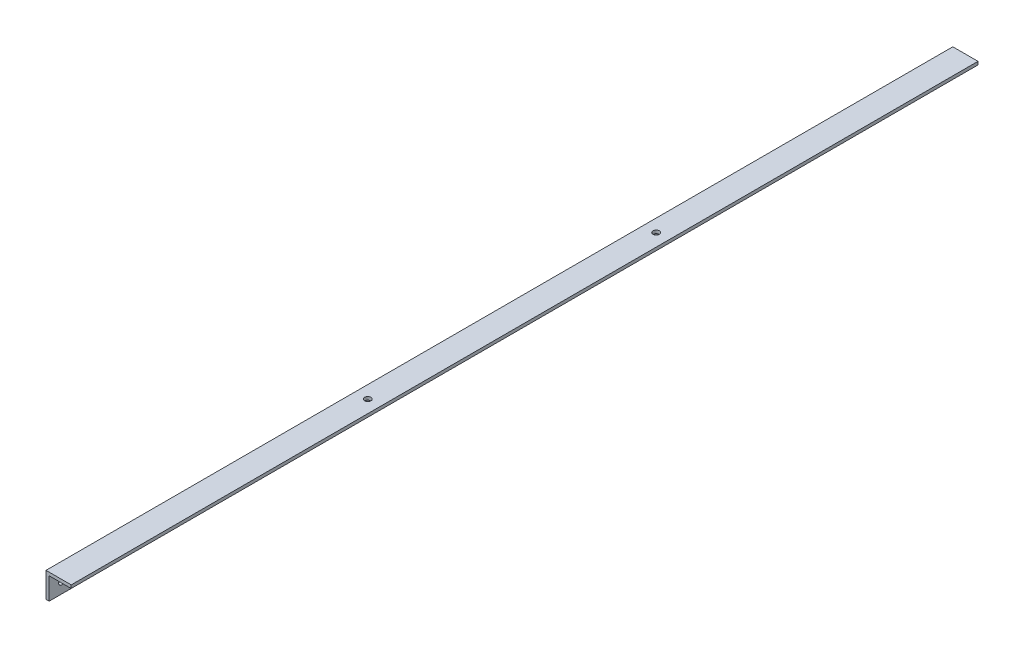
ISO-10303-21;
HEADER;
FILE_DESCRIPTION(('STEP AP214'),'2;1');
FILE_NAME('part.step','',(''),(''),'','','');
FILE_SCHEMA(('AUTOMOTIVE_DESIGN { 1 0 10303 214 1 1 1 1 }'));
ENDSEC;
DATA;
#1=APPLICATION_CONTEXT('core data for automotive mechanical design processes');
#2=APPLICATION_PROTOCOL_DEFINITION('international standard','automotive_design',2000,#1);
#3=PRODUCT_CONTEXT('',#1,'mechanical');
#4=PRODUCT('Part','Part','',(#3));
#5=PRODUCT_RELATED_PRODUCT_CATEGORY('part','',(#4));
#6=PRODUCT_DEFINITION_FORMATION('','',#4);
#7=PRODUCT_DEFINITION_CONTEXT('part definition',#1,'design');
#8=PRODUCT_DEFINITION('design','',#6,#7);
#9=PRODUCT_DEFINITION_SHAPE('','',#8);
#10=(LENGTH_UNIT() NAMED_UNIT(*) SI_UNIT(.MILLI.,.METRE.));
#11=(NAMED_UNIT(*) PLANE_ANGLE_UNIT() SI_UNIT($,.RADIAN.));
#12=(NAMED_UNIT(*) SI_UNIT($,.STERADIAN.) SOLID_ANGLE_UNIT());
#13=UNCERTAINTY_MEASURE_WITH_UNIT(LENGTH_MEASURE(1.E-05),#10,'distance_accuracy_value','');
#14=(GEOMETRIC_REPRESENTATION_CONTEXT(3) GLOBAL_UNCERTAINTY_ASSIGNED_CONTEXT((#13)) GLOBAL_UNIT_ASSIGNED_CONTEXT((#10,
#11,#12)) REPRESENTATION_CONTEXT('',''));
#15=CARTESIAN_POINT('',(0.,0.,0.));
#16=DIRECTION('',(0.,0.,1.));
#17=DIRECTION('',(1.,0.,0.));
#18=AXIS2_PLACEMENT_3D('',#15,#16,#17);
#19=CARTESIAN_POINT('',(3.175,0.,914.4));
#20=DIRECTION('',(0.,1.,0.));
#21=DIRECTION('',(0.,0.,1.));
#22=AXIS2_PLACEMENT_3D('',#19,#20,#21);
#23=PLANE('',#22);
#24=DIRECTION('',(1.,0.,0.));
#25=VECTOR('',#24,1.);
#26=CARTESIAN_POINT('',(3.175,0.,0.));
#27=LINE('',#26,#25);
#28=CARTESIAN_POINT('',(0.,0.,0.));
#29=VERTEX_POINT('',#28);
#30=CARTESIAN_POINT('',(3.175,0.,0.));
#31=VERTEX_POINT('',#30);
#32=EDGE_CURVE('E117',#29,#31,#27,.T.);
#33=ORIENTED_EDGE('',*,*,#32,.T.);
#34=DIRECTION('',(0.,0.,-1.));
#35=VECTOR('',#34,1.);
#36=CARTESIAN_POINT('',(3.175,0.,914.4));
#37=LINE('',#36,#35);
#38=CARTESIAN_POINT('',(3.175,0.,914.4));
#39=VERTEX_POINT('',#38);
#40=EDGE_CURVE('E11',#39,#31,#37,.T.);
#41=ORIENTED_EDGE('',*,*,#40,.F.);
#42=DIRECTION('',(1.,0.,0.));
#43=VECTOR('',#42,1.);
#44=CARTESIAN_POINT('',(3.175,0.,914.4));
#45=LINE('',#44,#43);
#46=CARTESIAN_POINT('',(0.,0.,914.4));
#47=VERTEX_POINT('',#46);
#48=EDGE_CURVE('E128',#47,#39,#45,.T.);
#49=ORIENTED_EDGE('',*,*,#48,.F.);
#50=DIRECTION('',(0.,0.,-1.));
#51=VECTOR('',#50,1.);
#52=CARTESIAN_POINT('',(0.,0.,914.4));
#53=LINE('',#52,#51);
#54=EDGE_CURVE('E113',#47,#29,#53,.T.);
#55=ORIENTED_EDGE('',*,*,#54,.T.);
#56=EDGE_LOOP('',(#33,#41,#49,#55));
#57=FACE_BOUND('',#56,.T.);
#58=ADVANCED_FACE('F33',(#57),#23,.F.);
#59=CARTESIAN_POINT('',(3.175,0.,914.4));
#60=DIRECTION('',(-1.,0.,0.));
#61=DIRECTION('',(0.,0.,1.));
#62=AXIS2_PLACEMENT_3D('',#59,#60,#61);
#63=PLANE('',#62);
#64=CARTESIAN_POINT('',(3.175,11.1124999999999,12.7));
#65=DIRECTION('',(1.,0.,0.));
#66=DIRECTION('',(0.,0.,-1.));
#67=AXIS2_PLACEMENT_3D('',#64,#65,#66);
#68=CIRCLE('',#67,3.175);
#69=CARTESIAN_POINT('',(3.175,11.1124999999999,9.52500000000004));
#70=VERTEX_POINT('',#69);
#71=EDGE_CURVE('E262',#70,#70,#68,.T.);
#72=ORIENTED_EDGE('',*,*,#71,.F.);
#73=EDGE_LOOP('',(#72));
#74=FACE_BOUND('',#73,.T.);
#75=CARTESIAN_POINT('',(3.175,11.1125,901.7));
#76=DIRECTION('',(1.,0.,0.));
#77=DIRECTION('',(0.,0.,-1.));
#78=AXIS2_PLACEMENT_3D('',#75,#76,#77);
#79=CIRCLE('',#78,3.17499999999997);
#80=CARTESIAN_POINT('',(3.175,11.1125,898.525));
#81=VERTEX_POINT('',#80);
#82=EDGE_CURVE('E265',#81,#81,#79,.T.);
#83=ORIENTED_EDGE('',*,*,#82,.F.);
#84=EDGE_LOOP('',(#83));
#85=FACE_BOUND('',#84,.T.);
#86=CARTESIAN_POINT('',(3.17500000000004,12.7,576.2625));
#87=DIRECTION('',(-1.,0.,0.));
#88=DIRECTION('',(0.,0.,1.));
#89=AXIS2_PLACEMENT_3D('',#86,#87,#88);
#90=CIRCLE('',#89,3.17499999999997);
#91=CARTESIAN_POINT('',(3.17500000000004,12.7,579.4375));
#92=VERTEX_POINT('',#91);
#93=EDGE_CURVE('E289',#92,#92,#90,.T.);
#94=ORIENTED_EDGE('',*,*,#93,.T.);
#95=EDGE_LOOP('',(#94));
#96=FACE_BOUND('',#95,.T.);
#97=CARTESIAN_POINT('',(3.17500000000004,12.7,338.1375));
#98=DIRECTION('',(-1.,0.,0.));
#99=DIRECTION('',(0.,0.,1.));
#100=AXIS2_PLACEMENT_3D('',#97,#98,#99);
#101=CIRCLE('',#100,3.17499999999997);
#102=CARTESIAN_POINT('',(3.17500000000004,12.7,341.3125));
#103=VERTEX_POINT('',#102);
#104=EDGE_CURVE('E121',#103,#103,#101,.T.);
#105=ORIENTED_EDGE('',*,*,#104,.T.);
#106=EDGE_LOOP('',(#105));
#107=FACE_BOUND('',#106,.T.);
#108=DIRECTION('',(0.,1.,0.));
#109=VECTOR('',#108,1.);
#110=CARTESIAN_POINT('',(3.175,0.,0.));
#111=LINE('',#110,#109);
#112=CARTESIAN_POINT('',(3.175,22.225,0.));
#113=VERTEX_POINT('',#112);
#114=EDGE_CURVE('E120',#31,#113,#111,.T.);
#115=ORIENTED_EDGE('',*,*,#114,.T.);
#116=DIRECTION('',(0.,0.,-1.));
#117=VECTOR('',#116,1.);
#118=CARTESIAN_POINT('',(3.175,22.225,914.4));
#119=LINE('',#118,#117);
#120=CARTESIAN_POINT('',(3.175,22.225,914.4));
#121=VERTEX_POINT('',#120);
#122=EDGE_CURVE('E41',#121,#113,#119,.T.);
#123=ORIENTED_EDGE('',*,*,#122,.F.);
#124=DIRECTION('',(0.,1.,0.));
#125=VECTOR('',#124,1.);
#126=CARTESIAN_POINT('',(3.175,0.,914.4));
#127=LINE('',#126,#125);
#128=EDGE_CURVE('E86',#39,#121,#127,.T.);
#129=ORIENTED_EDGE('',*,*,#128,.F.);
#130=ORIENTED_EDGE('',*,*,#40,.T.);
#131=EDGE_LOOP('',(#115,#123,#129,#130));
#132=FACE_BOUND('',#131,.T.);
#133=ADVANCED_FACE('F158',(#74,#85,#96,#107,#132),#63,.F.);
#134=CARTESIAN_POINT('',(3.175,22.225,914.4));
#135=DIRECTION('',(0.,1.,0.));
#136=DIRECTION('',(0.,0.,1.));
#137=AXIS2_PLACEMENT_3D('',#134,#135,#136);
#138=PLANE('',#137);
#139=CARTESIAN_POINT('',(12.7,22.225,602.59171024299));
#140=DIRECTION('',(0.,1.,0.));
#141=DIRECTION('',(0.,0.,1.));
#142=AXIS2_PLACEMENT_3D('',#139,#140,#141);
#143=CIRCLE('',#142,3.175);
#144=CARTESIAN_POINT('',(12.7,22.225,605.76671024299));
#145=VERTEX_POINT('',#144);
#146=EDGE_CURVE('E277',#145,#145,#143,.T.);
#147=ORIENTED_EDGE('',*,*,#146,.T.);
#148=EDGE_LOOP('',(#147));
#149=FACE_BOUND('',#148,.T.);
#150=CARTESIAN_POINT('',(12.7,22.225,311.80828975701));
#151=DIRECTION('',(0.,1.,0.));
#152=DIRECTION('',(0.,0.,1.));
#153=AXIS2_PLACEMENT_3D('',#150,#151,#152);
#154=CIRCLE('',#153,3.175);
#155=CARTESIAN_POINT('',(12.7,22.225,314.98328975701));
#156=VERTEX_POINT('',#155);
#157=EDGE_CURVE('E283',#156,#156,#154,.T.);
#158=ORIENTED_EDGE('',*,*,#157,.T.);
#159=EDGE_LOOP('',(#158));
#160=FACE_BOUND('',#159,.T.);
#161=DIRECTION('',(1.,0.,0.));
#162=VECTOR('',#161,1.);
#163=CARTESIAN_POINT('',(3.175,22.225,0.));
#164=LINE('',#163,#162);
#165=CARTESIAN_POINT('',(25.4,22.225,0.));
#166=VERTEX_POINT('',#165);
#167=EDGE_CURVE('E123',#113,#166,#164,.T.);
#168=ORIENTED_EDGE('',*,*,#167,.T.);
#169=DIRECTION('',(0.,0.,-1.));
#170=VECTOR('',#169,1.);
#171=CARTESIAN_POINT('',(25.4,22.225,914.4));
#172=LINE('',#171,#170);
#173=CARTESIAN_POINT('',(25.4,22.225,914.4));
#174=VERTEX_POINT('',#173);
#175=EDGE_CURVE('E108',#174,#166,#172,.T.);
#176=ORIENTED_EDGE('',*,*,#175,.F.);
#177=DIRECTION('',(1.,0.,0.));
#178=VECTOR('',#177,1.);
#179=CARTESIAN_POINT('',(3.175,22.225,914.4));
#180=LINE('',#179,#178);
#181=EDGE_CURVE('E99',#121,#174,#180,.T.);
#182=ORIENTED_EDGE('',*,*,#181,.F.);
#183=ORIENTED_EDGE('',*,*,#122,.T.);
#184=EDGE_LOOP('',(#168,#176,#182,#183));
#185=FACE_BOUND('',#184,.T.);
#186=ADVANCED_FACE('F134',(#149,#160,#185),#138,.F.);
#187=CARTESIAN_POINT('',(25.4,22.225,914.4));
#188=DIRECTION('',(-1.,0.,0.));
#189=DIRECTION('',(0.,0.,1.));
#190=AXIS2_PLACEMENT_3D('',#187,#188,#189);
#191=PLANE('',#190);
#192=DIRECTION('',(0.,1.,0.));
#193=VECTOR('',#192,1.);
#194=CARTESIAN_POINT('',(25.4,22.225,0.));
#195=LINE('',#194,#193);
#196=CARTESIAN_POINT('',(25.4,25.4,0.));
#197=VERTEX_POINT('',#196);
#198=EDGE_CURVE('E107',#166,#197,#195,.T.);
#199=ORIENTED_EDGE('',*,*,#198,.T.);
#200=DIRECTION('',(0.,0.,-1.));
#201=VECTOR('',#200,1.);
#202=CARTESIAN_POINT('',(25.4,25.4,914.4));
#203=LINE('',#202,#201);
#204=CARTESIAN_POINT('',(25.4,25.4,914.4));
#205=VERTEX_POINT('',#204);
#206=EDGE_CURVE('E104',#205,#197,#203,.T.);
#207=ORIENTED_EDGE('',*,*,#206,.F.);
#208=DIRECTION('',(0.,1.,0.));
#209=VECTOR('',#208,1.);
#210=CARTESIAN_POINT('',(25.4,22.225,914.4));
#211=LINE('',#210,#209);
#212=EDGE_CURVE('E93',#174,#205,#211,.T.);
#213=ORIENTED_EDGE('',*,*,#212,.F.);
#214=ORIENTED_EDGE('',*,*,#175,.T.);
#215=EDGE_LOOP('',(#199,#207,#213,#214));
#216=FACE_BOUND('',#215,.T.);
#217=ADVANCED_FACE('F105',(#216),#191,.F.);
#218=CARTESIAN_POINT('',(0.,25.4,914.4));
#219=DIRECTION('',(0.,-1.,0.));
#220=DIRECTION('',(0.,0.,-1.));
#221=AXIS2_PLACEMENT_3D('',#218,#219,#220);
#222=PLANE('',#221);
#223=CARTESIAN_POINT('',(12.7,25.4,602.59171024299));
#224=DIRECTION('',(0.,1.,0.));
#225=DIRECTION('',(0.,0.,1.));
#226=AXIS2_PLACEMENT_3D('',#223,#224,#225);
#227=CIRCLE('',#226,3.175);
#228=CARTESIAN_POINT('',(12.7,25.4,605.76671024299));
#229=VERTEX_POINT('',#228);
#230=EDGE_CURVE('E274',#229,#229,#227,.T.);
#231=ORIENTED_EDGE('',*,*,#230,.F.);
#232=EDGE_LOOP('',(#231));
#233=FACE_BOUND('',#232,.T.);
#234=CARTESIAN_POINT('',(12.7,25.4,311.80828975701));
#235=DIRECTION('',(0.,1.,0.));
#236=DIRECTION('',(0.,0.,-1.));
#237=AXIS2_PLACEMENT_3D('',#234,#235,#236);
#238=CIRCLE('',#237,3.175);
#239=CARTESIAN_POINT('',(12.7,25.4,308.63328975701));
#240=VERTEX_POINT('',#239);
#241=EDGE_CURVE('E280',#240,#240,#238,.T.);
#242=ORIENTED_EDGE('',*,*,#241,.F.);
#243=EDGE_LOOP('',(#242));
#244=FACE_BOUND('',#243,.T.);
#245=DIRECTION('',(-1.,0.,0.));
#246=VECTOR('',#245,1.);
#247=CARTESIAN_POINT('',(0.,25.4,0.));
#248=LINE('',#247,#246);
#249=CARTESIAN_POINT('',(0.,25.4,0.));
#250=VERTEX_POINT('',#249);
#251=EDGE_CURVE('E72',#197,#250,#248,.T.);
#252=ORIENTED_EDGE('',*,*,#251,.T.);
#253=DIRECTION('',(0.,0.,-1.));
#254=VECTOR('',#253,1.);
#255=CARTESIAN_POINT('',(0.,25.4,914.4));
#256=LINE('',#255,#254);
#257=CARTESIAN_POINT('',(0.,25.4,914.4));
#258=VERTEX_POINT('',#257);
#259=EDGE_CURVE('E109',#258,#250,#256,.T.);
#260=ORIENTED_EDGE('',*,*,#259,.F.);
#261=DIRECTION('',(-1.,0.,0.));
#262=VECTOR('',#261,1.);
#263=CARTESIAN_POINT('',(0.,25.4,914.4));
#264=LINE('',#263,#262);
#265=EDGE_CURVE('E97',#205,#258,#264,.T.);
#266=ORIENTED_EDGE('',*,*,#265,.F.);
#267=ORIENTED_EDGE('',*,*,#206,.T.);
#268=EDGE_LOOP('',(#252,#260,#266,#267));
#269=FACE_BOUND('',#268,.T.);
#270=ADVANCED_FACE('F111',(#233,#244,#269),#222,.F.);
#271=CARTESIAN_POINT('',(0.,0.,914.4));
#272=DIRECTION('',(1.,0.,0.));
#273=DIRECTION('',(0.,0.,-1.));
#274=AXIS2_PLACEMENT_3D('',#271,#272,#273);
#275=PLANE('',#274);
#276=CARTESIAN_POINT('',(0.,11.1124999999999,12.7));
#277=DIRECTION('',(1.,0.,0.));
#278=DIRECTION('',(0.,0.,-1.));
#279=AXIS2_PLACEMENT_3D('',#276,#277,#278);
#280=CIRCLE('',#279,3.175);
#281=CARTESIAN_POINT('',(0.,11.1124999999999,9.52500000000004));
#282=VERTEX_POINT('',#281);
#283=EDGE_CURVE('E264',#282,#282,#280,.F.);
#284=ORIENTED_EDGE('',*,*,#283,.F.);
#285=EDGE_LOOP('',(#284));
#286=FACE_BOUND('',#285,.T.);
#287=CARTESIAN_POINT('',(0.,11.1125,901.7));
#288=DIRECTION('',(1.,0.,0.));
#289=DIRECTION('',(0.,0.,-1.));
#290=AXIS2_PLACEMENT_3D('',#287,#288,#289);
#291=CIRCLE('',#290,3.17499999999997);
#292=CARTESIAN_POINT('',(0.,11.1125,898.525));
#293=VERTEX_POINT('',#292);
#294=EDGE_CURVE('E268',#293,#293,#291,.F.);
#295=ORIENTED_EDGE('',*,*,#294,.F.);
#296=EDGE_LOOP('',(#295));
#297=FACE_BOUND('',#296,.T.);
#298=CARTESIAN_POINT('',(0.,12.7,576.2625));
#299=DIRECTION('',(-1.,0.,0.));
#300=DIRECTION('',(0.,0.,-1.));
#301=AXIS2_PLACEMENT_3D('',#298,#299,#300);
#302=CIRCLE('',#301,3.17499999999997);
#303=CARTESIAN_POINT('',(0.,12.7,573.0875));
#304=VERTEX_POINT('',#303);
#305=EDGE_CURVE('E286',#304,#304,#302,.T.);
#306=ORIENTED_EDGE('',*,*,#305,.F.);
#307=EDGE_LOOP('',(#306));
#308=FACE_BOUND('',#307,.T.);
#309=CARTESIAN_POINT('',(0.,12.7,338.1375));
#310=DIRECTION('',(-1.,0.,0.));
#311=DIRECTION('',(0.,0.,1.));
#312=AXIS2_PLACEMENT_3D('',#309,#310,#311);
#313=CIRCLE('',#312,3.17499999999997);
#314=CARTESIAN_POINT('',(0.,12.7,341.3125));
#315=VERTEX_POINT('',#314);
#316=EDGE_CURVE('E292',#315,#315,#313,.T.);
#317=ORIENTED_EDGE('',*,*,#316,.F.);
#318=EDGE_LOOP('',(#317));
#319=FACE_BOUND('',#318,.T.);
#320=DIRECTION('',(0.,-1.,0.));
#321=VECTOR('',#320,1.);
#322=CARTESIAN_POINT('',(0.,0.,0.));
#323=LINE('',#322,#321);
#324=EDGE_CURVE('E78',#250,#29,#323,.T.);
#325=ORIENTED_EDGE('',*,*,#324,.T.);
#326=ORIENTED_EDGE('',*,*,#54,.F.);
#327=DIRECTION('',(0.,-1.,0.));
#328=VECTOR('',#327,1.);
#329=CARTESIAN_POINT('',(0.,0.,914.4));
#330=LINE('',#329,#328);
#331=EDGE_CURVE('E49',#258,#47,#330,.T.);
#332=ORIENTED_EDGE('',*,*,#331,.F.);
#333=ORIENTED_EDGE('',*,*,#259,.T.);
#334=EDGE_LOOP('',(#325,#326,#332,#333));
#335=FACE_BOUND('',#334,.T.);
#336=ADVANCED_FACE('F141',(#286,#297,#308,#319,#335),#275,.F.);
#337=CARTESIAN_POINT('',(0.,0.,914.4));
#338=DIRECTION('',(0.,0.,-1.));
#339=DIRECTION('',(-1.,0.,0.));
#340=AXIS2_PLACEMENT_3D('',#337,#338,#339);
#341=PLANE('',#340);
#342=ORIENTED_EDGE('',*,*,#48,.T.);
#343=ORIENTED_EDGE('',*,*,#128,.T.);
#344=ORIENTED_EDGE('',*,*,#181,.T.);
#345=ORIENTED_EDGE('',*,*,#212,.T.);
#346=ORIENTED_EDGE('',*,*,#265,.T.);
#347=ORIENTED_EDGE('',*,*,#331,.T.);
#348=EDGE_LOOP('',(#342,#343,#344,#345,#346,#347));
#349=FACE_BOUND('',#348,.T.);
#350=ADVANCED_FACE('F95',(#349),#341,.F.);
#351=CARTESIAN_POINT('',(0.,0.,0.));
#352=DIRECTION('',(0.,0.,-1.));
#353=DIRECTION('',(-1.,0.,0.));
#354=AXIS2_PLACEMENT_3D('',#351,#352,#353);
#355=PLANE('',#354);
#356=ORIENTED_EDGE('',*,*,#32,.F.);
#357=ORIENTED_EDGE('',*,*,#324,.F.);
#358=ORIENTED_EDGE('',*,*,#251,.F.);
#359=ORIENTED_EDGE('',*,*,#198,.F.);
#360=ORIENTED_EDGE('',*,*,#167,.F.);
#361=ORIENTED_EDGE('',*,*,#114,.F.);
#362=EDGE_LOOP('',(#356,#357,#358,#359,#360,#361));
#363=FACE_BOUND('',#362,.T.);
#364=ADVANCED_FACE('F137',(#363),#355,.T.);
#365=CARTESIAN_POINT('',(914.4,12.7,338.1375));
#366=DIRECTION('',(-1.,0.,0.));
#367=DIRECTION('',(0.,0.,1.));
#368=AXIS2_PLACEMENT_3D('',#365,#366,#367);
#369=CYLINDRICAL_SURFACE('',#368,3.17499999999997);
#370=ORIENTED_EDGE('',*,*,#316,.T.);
#371=EDGE_LOOP('',(#370));
#372=FACE_BOUND('',#371,.T.);
#373=ORIENTED_EDGE('',*,*,#104,.F.);
#374=EDGE_LOOP('',(#373));
#375=FACE_BOUND('',#374,.T.);
#376=ADVANCED_FACE('F198',(#372,#375),#369,.F.);
#377=CARTESIAN_POINT('',(914.4,12.7,576.2625));
#378=DIRECTION('',(-1.,0.,0.));
#379=DIRECTION('',(0.,0.,1.));
#380=AXIS2_PLACEMENT_3D('',#377,#378,#379);
#381=CYLINDRICAL_SURFACE('',#380,3.17499999999997);
#382=ORIENTED_EDGE('',*,*,#305,.T.);
#383=EDGE_LOOP('',(#382));
#384=FACE_BOUND('',#383,.T.);
#385=ORIENTED_EDGE('',*,*,#93,.F.);
#386=EDGE_LOOP('',(#385));
#387=FACE_BOUND('',#386,.T.);
#388=ADVANCED_FACE('F204',(#384,#387),#381,.F.);
#389=CARTESIAN_POINT('',(12.7,0.,311.80828975701));
#390=DIRECTION('',(0.,1.,0.));
#391=DIRECTION('',(0.,0.,1.));
#392=AXIS2_PLACEMENT_3D('',#389,#390,#391);
#393=CYLINDRICAL_SURFACE('',#392,3.175);
#394=ORIENTED_EDGE('',*,*,#241,.T.);
#395=EDGE_LOOP('',(#394));
#396=FACE_BOUND('',#395,.T.);
#397=ORIENTED_EDGE('',*,*,#157,.F.);
#398=EDGE_LOOP('',(#397));
#399=FACE_BOUND('',#398,.T.);
#400=ADVANCED_FACE('F212',(#396,#399),#393,.F.);
#401=CARTESIAN_POINT('',(12.7,0.,602.59171024299));
#402=DIRECTION('',(0.,1.,0.));
#403=DIRECTION('',(0.,0.,1.));
#404=AXIS2_PLACEMENT_3D('',#401,#402,#403);
#405=CYLINDRICAL_SURFACE('',#404,3.175);
#406=ORIENTED_EDGE('',*,*,#230,.T.);
#407=EDGE_LOOP('',(#406));
#408=FACE_BOUND('',#407,.T.);
#409=ORIENTED_EDGE('',*,*,#146,.F.);
#410=EDGE_LOOP('',(#409));
#411=FACE_BOUND('',#410,.T.);
#412=ADVANCED_FACE('F219',(#408,#411),#405,.F.);
#413=CARTESIAN_POINT('',(-0.00100000000000013,11.1125,901.7));
#414=DIRECTION('',(1.,0.,0.));
#415=DIRECTION('',(0.,0.,-1.));
#416=AXIS2_PLACEMENT_3D('',#413,#414,#415);
#417=CYLINDRICAL_SURFACE('',#416,3.17499999999997);
#418=ORIENTED_EDGE('',*,*,#82,.T.);
#419=EDGE_LOOP('',(#418));
#420=FACE_BOUND('',#419,.T.);
#421=ORIENTED_EDGE('',*,*,#294,.T.);
#422=EDGE_LOOP('',(#421));
#423=FACE_BOUND('',#422,.T.);
#424=ADVANCED_FACE('F226',(#420,#423),#417,.F.);
#425=CARTESIAN_POINT('',(-0.00100000000000013,11.1124999999999,12.7));
#426=DIRECTION('',(1.,0.,0.));
#427=DIRECTION('',(0.,0.,-1.));
#428=AXIS2_PLACEMENT_3D('',#425,#426,#427);
#429=CYLINDRICAL_SURFACE('',#428,3.175);
#430=ORIENTED_EDGE('',*,*,#71,.T.);
#431=EDGE_LOOP('',(#430));
#432=FACE_BOUND('',#431,.T.);
#433=ORIENTED_EDGE('',*,*,#283,.T.);
#434=EDGE_LOOP('',(#433));
#435=FACE_BOUND('',#434,.T.);
#436=ADVANCED_FACE('F233',(#432,#435),#429,.F.);
#437=CLOSED_SHELL('',(#58,#133,#186,#217,#270,#336,#350,#364,#376,#388,#400,#412,#424,#436));
#438=MANIFOLD_SOLID_BREP('B2',#437);
#439=ADVANCED_BREP_SHAPE_REPRESENTATION('',(#18,#438),#14);
#440=SHAPE_DEFINITION_REPRESENTATION(#9,#439);
ENDSEC;
END-ISO-10303-21;
